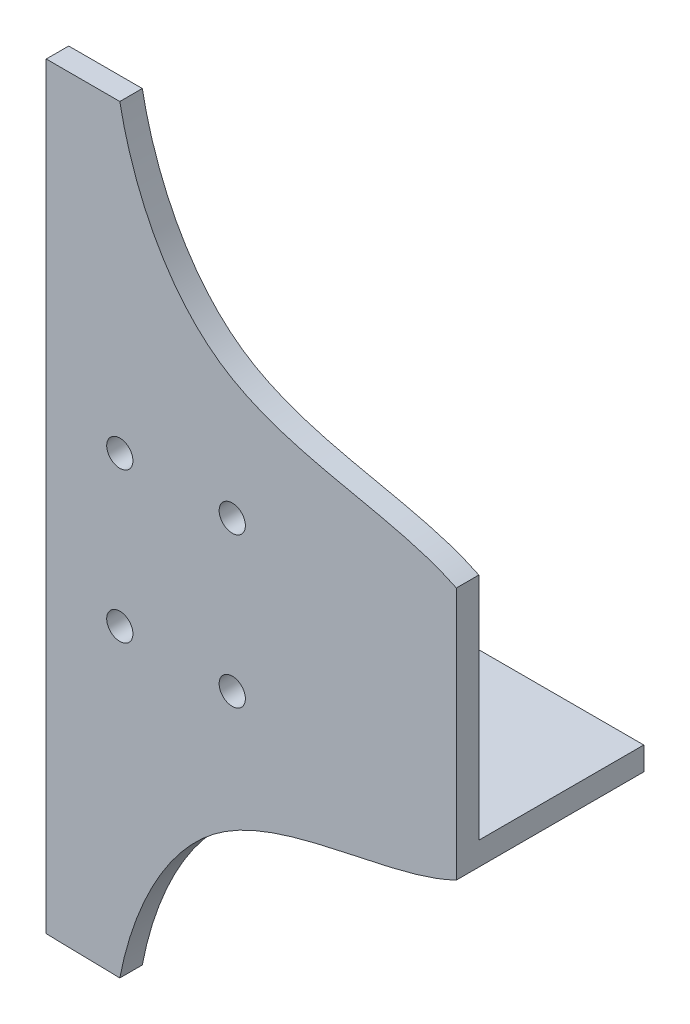
ISO-10303-21;
HEADER;
FILE_DESCRIPTION(('STEP AP214'),'2;1');
FILE_NAME('part.step','',(''),(''),'','','');
FILE_SCHEMA(('AUTOMOTIVE_DESIGN { 1 0 10303 214 1 1 1 1 }'));
ENDSEC;
DATA;
#1=APPLICATION_CONTEXT('core data for automotive mechanical design processes');
#2=APPLICATION_PROTOCOL_DEFINITION('international standard','automotive_design',2000,#1);
#3=PRODUCT_CONTEXT('',#1,'mechanical');
#4=PRODUCT('Part','Part','',(#3));
#5=PRODUCT_RELATED_PRODUCT_CATEGORY('part','',(#4));
#6=PRODUCT_DEFINITION_FORMATION('','',#4);
#7=PRODUCT_DEFINITION_CONTEXT('part definition',#1,'design');
#8=PRODUCT_DEFINITION('design','',#6,#7);
#9=PRODUCT_DEFINITION_SHAPE('','',#8);
#10=(LENGTH_UNIT() NAMED_UNIT(*) SI_UNIT(.MILLI.,.METRE.));
#11=(NAMED_UNIT(*) PLANE_ANGLE_UNIT() SI_UNIT($,.RADIAN.));
#12=(NAMED_UNIT(*) SI_UNIT($,.STERADIAN.) SOLID_ANGLE_UNIT());
#13=UNCERTAINTY_MEASURE_WITH_UNIT(LENGTH_MEASURE(1.E-05),#10,'distance_accuracy_value','');
#14=(GEOMETRIC_REPRESENTATION_CONTEXT(3) GLOBAL_UNCERTAINTY_ASSIGNED_CONTEXT((#13)) GLOBAL_UNIT_ASSIGNED_CONTEXT((#10,
#11,#12)) REPRESENTATION_CONTEXT('',''));
#15=CARTESIAN_POINT('',(0.,0.,0.));
#16=DIRECTION('',(0.,0.,1.));
#17=DIRECTION('',(1.,0.,0.));
#18=AXIS2_PLACEMENT_3D('',#15,#16,#17);
#19=CARTESIAN_POINT('',(25.7096128380882,-25.6261632332562,0.));
#20=DIRECTION('',(0.,0.,1.));
#21=DIRECTION('',(1.,0.,0.));
#22=AXIS2_PLACEMENT_3D('',#19,#20,#21);
#23=PLANE('',#22);
#24=CARTESIAN_POINT('',(9.85,-10.0000000000001,0.));
#25=DIRECTION('',(0.,0.,1.));
#26=DIRECTION('',(1.,0.,0.));
#27=AXIS2_PLACEMENT_3D('',#24,#25,#26);
#28=CIRCLE('',#27,1.75);
#29=CARTESIAN_POINT('',(11.6,-10.0000000000001,0.));
#30=VERTEX_POINT('',#29);
#31=EDGE_CURVE('E136',#30,#30,#28,.T.);
#32=ORIENTED_EDGE('',*,*,#31,.T.);
#33=EDGE_LOOP('',(#32));
#34=FACE_BOUND('',#33,.T.);
#35=CARTESIAN_POINT('',(24.85,-10.0000000000001,0.));
#36=DIRECTION('',(0.,0.,1.));
#37=DIRECTION('',(1.,0.,0.));
#38=AXIS2_PLACEMENT_3D('',#35,#36,#37);
#39=CIRCLE('',#38,1.75);
#40=CARTESIAN_POINT('',(26.6,-10.0000000000001,0.));
#41=VERTEX_POINT('',#40);
#42=EDGE_CURVE('E146',#41,#41,#39,.T.);
#43=ORIENTED_EDGE('',*,*,#42,.T.);
#44=EDGE_LOOP('',(#43));
#45=FACE_BOUND('',#44,.T.);
#46=CARTESIAN_POINT('',(24.85,9.99999999999991,0.));
#47=DIRECTION('',(0.,0.,1.));
#48=DIRECTION('',(1.,0.,0.));
#49=AXIS2_PLACEMENT_3D('',#46,#47,#48);
#50=CIRCLE('',#49,1.75);
#51=CARTESIAN_POINT('',(26.6,9.99999999999991,0.));
#52=VERTEX_POINT('',#51);
#53=EDGE_CURVE('E151',#52,#52,#50,.T.);
#54=ORIENTED_EDGE('',*,*,#53,.T.);
#55=EDGE_LOOP('',(#54));
#56=FACE_BOUND('',#55,.T.);
#57=CARTESIAN_POINT('',(9.85,9.99999999999991,0.));
#58=DIRECTION('',(0.,0.,1.));
#59=DIRECTION('',(1.,0.,0.));
#60=AXIS2_PLACEMENT_3D('',#57,#58,#59);
#61=CIRCLE('',#60,1.75);
#62=CARTESIAN_POINT('',(11.6,9.99999999999991,0.));
#63=VERTEX_POINT('',#62);
#64=EDGE_CURVE('E157',#63,#63,#61,.T.);
#65=ORIENTED_EDGE('',*,*,#64,.T.);
#66=EDGE_LOOP('',(#65));
#67=FACE_BOUND('',#66,.T.);
#68=DIRECTION('',(1.,0.,0.));
#69=VECTOR('',#68,1.);
#70=CARTESIAN_POINT('',(54.7461250743272,-13.7616615724123,0.));
#71=LINE('',#70,#69);
#72=CARTESIAN_POINT('',(0.0333691838635825,-13.7616615724123,0.));
#73=VERTEX_POINT('',#72);
#74=CARTESIAN_POINT('',(54.7461250743272,-13.7616615724123,0.));
#75=VERTEX_POINT('',#74);
#76=EDGE_CURVE('E53',#73,#75,#71,.T.);
#77=ORIENTED_EDGE('',*,*,#76,.F.);
#78=DIRECTION('',(0.,-1.,0.));
#79=VECTOR('',#78,1.);
#80=CARTESIAN_POINT('',(0.0333691838635825,50.6319572936936,0.));
#81=LINE('',#80,#79);
#82=CARTESIAN_POINT('',(0.0333691838635825,50.6319572936936,0.));
#83=VERTEX_POINT('',#82);
#84=EDGE_CURVE('E229',#83,#73,#81,.T.);
#85=ORIENTED_EDGE('',*,*,#84,.F.);
#86=DIRECTION('',(-1.,0.,0.));
#87=VECTOR('',#86,1.);
#88=CARTESIAN_POINT('',(9.85,50.6319572936936,0.));
#89=LINE('',#88,#87);
#90=CARTESIAN_POINT('',(9.85,50.6319572936936,0.));
#91=VERTEX_POINT('',#90);
#92=EDGE_CURVE('E163',#91,#83,#89,.T.);
#93=ORIENTED_EDGE('',*,*,#92,.F.);
#94=CARTESIAN_POINT('',(54.7461250743272,16.8731980908246,0.));
#95=CARTESIAN_POINT('',(45.7885361403111,21.2886150110364,0.));
#96=CARTESIAN_POINT('',(21.0377689368127,20.5399305747445,0.));
#97=CARTESIAN_POINT('',(11.4852943238361,41.9878824003416,0.));
#98=CARTESIAN_POINT('',(9.85,50.6319572936936,0.));
#99=B_SPLINE_CURVE_WITH_KNOTS('',3,(#94,#95,#96,#97,#98),.UNSPECIFIED.,.F.,.F.,(4,1,4),(0.,
0.549104100057966,1.),.UNSPECIFIED.);
#100=CARTESIAN_POINT('',(54.7461250743272,16.8731980908246,0.));
#101=VERTEX_POINT('',#100);
#102=EDGE_CURVE('E170',#101,#91,#99,.T.);
#103=ORIENTED_EDGE('',*,*,#102,.F.);
#104=DIRECTION('',(0.,1.,0.));
#105=VECTOR('',#104,1.);
#106=CARTESIAN_POINT('',(54.7461250743272,-16.8731980908246,0.));
#107=LINE('',#106,#105);
#108=EDGE_CURVE('E58',#75,#101,#107,.T.);
#109=ORIENTED_EDGE('',*,*,#108,.F.);
#110=EDGE_LOOP('',(#77,#85,#93,#103,#109));
#111=FACE_BOUND('',#110,.T.);
#112=ADVANCED_FACE('F38',(#34,#45,#56,#67,#111),#23,.F.);
#113=DIRECTION('',(-1.,0.,0.));
#114=VECTOR('',#113,1.);
#115=CARTESIAN_POINT('',(54.7461250743272,-16.8731980908246,0.));
#116=LINE('',#115,#114);
#117=CARTESIAN_POINT('',(54.7461250743272,-16.8731980908246,0.));
#118=VERTEX_POINT('',#117);
#119=CARTESIAN_POINT('',(0.0333691838635825,-16.8731980908246,0.));
#120=VERTEX_POINT('',#119);
#121=EDGE_CURVE('E262',#118,#120,#116,.T.);
#122=ORIENTED_EDGE('',*,*,#121,.F.);
#123=CARTESIAN_POINT('',(9.85,-50.6319572936936,0.));
#124=CARTESIAN_POINT('',(11.4852943238361,-41.9878824003416,0.));
#125=CARTESIAN_POINT('',(21.0377689368127,-20.5399305747445,0.));
#126=CARTESIAN_POINT('',(45.7885361403111,-21.2886150110364,0.));
#127=CARTESIAN_POINT('',(54.7461250743272,-16.8731980908246,0.));
#128=B_SPLINE_CURVE_WITH_KNOTS('',3,(#123,#124,#125,#126,#127),.UNSPECIFIED.,.F.,.F.,(4,1,4),
(0.,0.450895899942034,1.),.UNSPECIFIED.);
#129=CARTESIAN_POINT('',(9.85,-50.6319572936936,0.));
#130=VERTEX_POINT('',#129);
#131=EDGE_CURVE('E233',#130,#118,#128,.T.);
#132=ORIENTED_EDGE('',*,*,#131,.F.);
#133=DIRECTION('',(0.999776982868837,-0.0211183457137456,0.));
#134=VECTOR('',#133,1.);
#135=CARTESIAN_POINT('',(0.0333691838635825,-50.4246000461558,0.));
#136=LINE('',#135,#134);
#137=CARTESIAN_POINT('',(0.0333691838635825,-50.4246000461558,0.));
#138=VERTEX_POINT('',#137);
#139=EDGE_CURVE('E231',#138,#130,#136,.T.);
#140=ORIENTED_EDGE('',*,*,#139,.F.);
#141=EDGE_CURVE('E228',#120,#138,#81,.T.);
#142=ORIENTED_EDGE('',*,*,#141,.F.);
#143=EDGE_LOOP('',(#122,#132,#140,#142));
#144=FACE_BOUND('',#143,.T.);
#145=ADVANCED_FACE('F203',(#144),#23,.F.);
#146=CARTESIAN_POINT('',(25.7096128380882,-25.6261632332562,3.));
#147=DIRECTION('',(0.,0.,1.));
#148=DIRECTION('',(1.,0.,0.));
#149=AXIS2_PLACEMENT_3D('',#146,#147,#148);
#150=PLANE('',#149);
#151=CARTESIAN_POINT('',(24.85,-10.0000000000001,3.));
#152=DIRECTION('',(0.,0.,1.));
#153=DIRECTION('',(1.,0.,0.));
#154=AXIS2_PLACEMENT_3D('',#151,#152,#153);
#155=CIRCLE('',#154,1.75);
#156=CARTESIAN_POINT('',(26.6,-10.0000000000001,3.));
#157=VERTEX_POINT('',#156);
#158=EDGE_CURVE('E148',#157,#157,#155,.T.);
#159=ORIENTED_EDGE('',*,*,#158,.F.);
#160=EDGE_LOOP('',(#159));
#161=FACE_BOUND('',#160,.T.);
#162=CARTESIAN_POINT('',(9.85,9.99999999999991,3.));
#163=DIRECTION('',(0.,0.,1.));
#164=DIRECTION('',(1.,0.,0.));
#165=AXIS2_PLACEMENT_3D('',#162,#163,#164);
#166=CIRCLE('',#165,1.75);
#167=CARTESIAN_POINT('',(11.6,9.99999999999991,3.));
#168=VERTEX_POINT('',#167);
#169=EDGE_CURVE('E160',#168,#168,#166,.T.);
#170=ORIENTED_EDGE('',*,*,#169,.F.);
#171=EDGE_LOOP('',(#170));
#172=FACE_BOUND('',#171,.T.);
#173=DIRECTION('',(-1.,0.,0.));
#174=VECTOR('',#173,1.);
#175=CARTESIAN_POINT('',(9.85,50.6319572936936,3.));
#176=LINE('',#175,#174);
#177=CARTESIAN_POINT('',(9.85,50.6319572936936,3.));
#178=VERTEX_POINT('',#177);
#179=CARTESIAN_POINT('',(0.0333691838635825,50.6319572936936,3.));
#180=VERTEX_POINT('',#179);
#181=EDGE_CURVE('E166',#178,#180,#176,.T.);
#182=ORIENTED_EDGE('',*,*,#181,.T.);
#183=DIRECTION('',(0.,-1.,0.));
#184=VECTOR('',#183,1.);
#185=CARTESIAN_POINT('',(0.0333691838635825,50.6319572936936,3.));
#186=LINE('',#185,#184);
#187=CARTESIAN_POINT('',(0.0333691838635825,-50.4246000461558,3.));
#188=VERTEX_POINT('',#187);
#189=EDGE_CURVE('E169',#180,#188,#186,.T.);
#190=ORIENTED_EDGE('',*,*,#189,.T.);
#191=DIRECTION('',(0.999776982868837,-0.0211183457137456,0.));
#192=VECTOR('',#191,1.);
#193=CARTESIAN_POINT('',(0.0333691838635825,-50.4246000461558,3.));
#194=LINE('',#193,#192);
#195=CARTESIAN_POINT('',(9.85,-50.6319572936936,3.));
#196=VERTEX_POINT('',#195);
#197=EDGE_CURVE('E172',#188,#196,#194,.T.);
#198=ORIENTED_EDGE('',*,*,#197,.T.);
#199=CARTESIAN_POINT('',(9.85,-50.6319572936936,3.));
#200=CARTESIAN_POINT('',(11.4852943238361,-41.9878824003416,3.));
#201=CARTESIAN_POINT('',(21.0377689368127,-20.5399305747445,3.));
#202=CARTESIAN_POINT('',(45.7885361403111,-21.2886150110364,3.));
#203=CARTESIAN_POINT('',(54.7461250743272,-16.8731980908246,3.));
#204=B_SPLINE_CURVE_WITH_KNOTS('',3,(#199,#200,#201,#202,#203),.UNSPECIFIED.,.F.,.F.,(4,1,4),
(0.,0.450895899942034,1.),.UNSPECIFIED.);
#205=CARTESIAN_POINT('',(54.7461250743272,-16.8731980908246,3.));
#206=VERTEX_POINT('',#205);
#207=EDGE_CURVE('E174',#196,#206,#204,.T.);
#208=ORIENTED_EDGE('',*,*,#207,.T.);
#209=DIRECTION('',(0.,1.,0.));
#210=VECTOR('',#209,1.);
#211=CARTESIAN_POINT('',(54.7461250743272,-16.8731980908246,3.));
#212=LINE('',#211,#210);
#213=CARTESIAN_POINT('',(54.7461250743272,16.8731980908246,3.));
#214=VERTEX_POINT('',#213);
#215=EDGE_CURVE('E179',#206,#214,#212,.T.);
#216=ORIENTED_EDGE('',*,*,#215,.T.);
#217=CARTESIAN_POINT('',(54.7461250743272,16.8731980908246,3.));
#218=CARTESIAN_POINT('',(45.7885361403111,21.2886150110364,3.));
#219=CARTESIAN_POINT('',(21.0377689368127,20.5399305747445,3.));
#220=CARTESIAN_POINT('',(11.4852943238361,41.9878824003416,3.));
#221=CARTESIAN_POINT('',(9.85,50.6319572936936,3.));
#222=B_SPLINE_CURVE_WITH_KNOTS('',3,(#217,#218,#219,#220,#221),.UNSPECIFIED.,.F.,.F.,(4,1,4),
(0.,0.549104100057966,1.),.UNSPECIFIED.);
#223=EDGE_CURVE('E217',#214,#178,#222,.T.);
#224=ORIENTED_EDGE('',*,*,#223,.T.);
#225=EDGE_LOOP('',(#182,#190,#198,#208,#216,#224));
#226=FACE_BOUND('',#225,.T.);
#227=CARTESIAN_POINT('',(24.85,9.99999999999991,3.));
#228=DIRECTION('',(0.,0.,1.));
#229=DIRECTION('',(1.,0.,0.));
#230=AXIS2_PLACEMENT_3D('',#227,#228,#229);
#231=CIRCLE('',#230,1.75);
#232=CARTESIAN_POINT('',(26.6,9.99999999999991,3.));
#233=VERTEX_POINT('',#232);
#234=EDGE_CURVE('E154',#233,#233,#231,.T.);
#235=ORIENTED_EDGE('',*,*,#234,.F.);
#236=EDGE_LOOP('',(#235));
#237=FACE_BOUND('',#236,.T.);
#238=CARTESIAN_POINT('',(9.85,-10.0000000000001,3.));
#239=DIRECTION('',(0.,0.,1.));
#240=DIRECTION('',(1.,0.,0.));
#241=AXIS2_PLACEMENT_3D('',#238,#239,#240);
#242=CIRCLE('',#241,1.75);
#243=CARTESIAN_POINT('',(11.6,-10.0000000000001,3.));
#244=VERTEX_POINT('',#243);
#245=EDGE_CURVE('E139',#244,#244,#242,.T.);
#246=ORIENTED_EDGE('',*,*,#245,.F.);
#247=EDGE_LOOP('',(#246));
#248=FACE_BOUND('',#247,.T.);
#249=ADVANCED_FACE('F200',(#161,#172,#226,#237,#248),#150,.T.);
#250=CARTESIAN_POINT('',(9.85,50.6319572936936,3.));
#251=DIRECTION('',(0.,-1.,0.));
#252=DIRECTION('',(0.,0.,-1.));
#253=AXIS2_PLACEMENT_3D('',#250,#251,#252);
#254=PLANE('',#253);
#255=ORIENTED_EDGE('',*,*,#92,.T.);
#256=DIRECTION('',(0.,0.,-1.));
#257=VECTOR('',#256,1.);
#258=CARTESIAN_POINT('',(0.0333691838635825,50.6319572936936,3.));
#259=LINE('',#258,#257);
#260=EDGE_CURVE('E12',#180,#83,#259,.T.);
#261=ORIENTED_EDGE('',*,*,#260,.F.);
#262=ORIENTED_EDGE('',*,*,#181,.F.);
#263=DIRECTION('',(0.,0.,-1.));
#264=VECTOR('',#263,1.);
#265=CARTESIAN_POINT('',(9.85,50.6319572936936,3.));
#266=LINE('',#265,#264);
#267=EDGE_CURVE('E222',#178,#91,#266,.T.);
#268=ORIENTED_EDGE('',*,*,#267,.T.);
#269=EDGE_LOOP('',(#255,#261,#262,#268));
#270=FACE_BOUND('',#269,.T.);
#271=ADVANCED_FACE('F40',(#270),#254,.F.);
#272=CARTESIAN_POINT('',(0.0333691838635825,50.6319572936936,3.));
#273=DIRECTION('',(1.,0.,0.));
#274=DIRECTION('',(0.,0.,-1.));
#275=AXIS2_PLACEMENT_3D('',#272,#273,#274);
#276=PLANE('',#275);
#277=ORIENTED_EDGE('',*,*,#84,.T.);
#278=DIRECTION('',(0.,0.,1.));
#279=VECTOR('',#278,1.);
#280=CARTESIAN_POINT('',(0.0333691838635825,-13.7616615724123,-22.));
#281=LINE('',#280,#279);
#282=CARTESIAN_POINT('',(0.0333691838635825,-13.7616615724123,-22.));
#283=VERTEX_POINT('',#282);
#284=EDGE_CURVE('E141',#283,#73,#281,.T.);
#285=ORIENTED_EDGE('',*,*,#284,.F.);
#286=DIRECTION('',(0.,1.,0.));
#287=VECTOR('',#286,1.);
#288=CARTESIAN_POINT('',(0.0333691838635825,-16.8731980908246,-22.));
#289=LINE('',#288,#287);
#290=CARTESIAN_POINT('',(0.0333691838635825,-16.8731980908246,-22.));
#291=VERTEX_POINT('',#290);
#292=EDGE_CURVE('E120',#291,#283,#289,.T.);
#293=ORIENTED_EDGE('',*,*,#292,.F.);
#294=DIRECTION('',(0.,0.,1.));
#295=VECTOR('',#294,1.);
#296=CARTESIAN_POINT('',(0.0333691838635825,-16.8731980908246,-22.));
#297=LINE('',#296,#295);
#298=EDGE_CURVE('E117',#291,#120,#297,.T.);
#299=ORIENTED_EDGE('',*,*,#298,.T.);
#300=ORIENTED_EDGE('',*,*,#141,.T.);
#301=DIRECTION('',(0.,0.,-1.));
#302=VECTOR('',#301,1.);
#303=CARTESIAN_POINT('',(0.0333691838635825,-50.4246000461558,3.));
#304=LINE('',#303,#302);
#305=EDGE_CURVE('E46',#188,#138,#304,.T.);
#306=ORIENTED_EDGE('',*,*,#305,.F.);
#307=ORIENTED_EDGE('',*,*,#189,.F.);
#308=ORIENTED_EDGE('',*,*,#260,.T.);
#309=EDGE_LOOP('',(#277,#285,#293,#299,#300,#306,#307,#308));
#310=FACE_BOUND('',#309,.T.);
#311=ADVANCED_FACE('F193',(#310),#276,.F.);
#312=CARTESIAN_POINT('',(0.0333691838635825,-50.4246000461558,3.));
#313=DIRECTION('',(0.0211183457137456,0.999776982868837,0.));
#314=DIRECTION('',(-0.999776982868837,0.0211183457137456,0.));
#315=AXIS2_PLACEMENT_3D('',#312,#313,#314);
#316=PLANE('',#315);
#317=ORIENTED_EDGE('',*,*,#139,.T.);
#318=DIRECTION('',(0.,0.,-1.));
#319=VECTOR('',#318,1.);
#320=CARTESIAN_POINT('',(9.85,-50.6319572936936,3.));
#321=LINE('',#320,#319);
#322=EDGE_CURVE('E254',#196,#130,#321,.T.);
#323=ORIENTED_EDGE('',*,*,#322,.F.);
#324=ORIENTED_EDGE('',*,*,#197,.F.);
#325=ORIENTED_EDGE('',*,*,#305,.T.);
#326=EDGE_LOOP('',(#317,#323,#324,#325));
#327=FACE_BOUND('',#326,.T.);
#328=ADVANCED_FACE('F189',(#327),#316,.F.);
#329=DIRECTION('',(0.,0.,-1.));
#330=VECTOR('',#329,1.);
#331=SURFACE_OF_LINEAR_EXTRUSION('',#204,#330);
#332=ORIENTED_EDGE('',*,*,#131,.T.);
#333=DIRECTION('',(0.,0.,-1.));
#334=VECTOR('',#333,1.);
#335=CARTESIAN_POINT('',(54.7461250743272,-16.8731980908246,3.));
#336=LINE('',#335,#334);
#337=EDGE_CURVE('E135',#206,#118,#336,.T.);
#338=ORIENTED_EDGE('',*,*,#337,.F.);
#339=ORIENTED_EDGE('',*,*,#207,.F.);
#340=ORIENTED_EDGE('',*,*,#322,.T.);
#341=EDGE_LOOP('',(#332,#338,#339,#340));
#342=FACE_BOUND('',#341,.T.);
#343=ADVANCED_FACE('F185',(#342),#331,.F.);
#344=CARTESIAN_POINT('',(54.7461250743272,-16.8731980908246,3.));
#345=DIRECTION('',(-1.,0.,0.));
#346=DIRECTION('',(0.,-1.,0.));
#347=AXIS2_PLACEMENT_3D('',#344,#345,#346);
#348=PLANE('',#347);
#349=ORIENTED_EDGE('',*,*,#337,.T.);
#350=DIRECTION('',(0.,0.,1.));
#351=VECTOR('',#350,1.);
#352=CARTESIAN_POINT('',(54.7461250743272,-16.8731980908246,-22.));
#353=LINE('',#352,#351);
#354=CARTESIAN_POINT('',(54.7461250743272,-16.8731980908246,-22.));
#355=VERTEX_POINT('',#354);
#356=EDGE_CURVE('E115',#355,#118,#353,.T.);
#357=ORIENTED_EDGE('',*,*,#356,.F.);
#358=DIRECTION('',(0.,-1.,0.));
#359=VECTOR('',#358,1.);
#360=CARTESIAN_POINT('',(54.7461250743272,-13.7616615724123,-22.));
#361=LINE('',#360,#359);
#362=CARTESIAN_POINT('',(54.7461250743272,-13.7616615724123,-22.));
#363=VERTEX_POINT('',#362);
#364=EDGE_CURVE('E121',#363,#355,#361,.T.);
#365=ORIENTED_EDGE('',*,*,#364,.F.);
#366=DIRECTION('',(0.,0.,1.));
#367=VECTOR('',#366,1.);
#368=CARTESIAN_POINT('',(54.7461250743272,-13.7616615724123,-22.));
#369=LINE('',#368,#367);
#370=EDGE_CURVE('E274',#363,#75,#369,.T.);
#371=ORIENTED_EDGE('',*,*,#370,.T.);
#372=ORIENTED_EDGE('',*,*,#108,.T.);
#373=DIRECTION('',(0.,0.,-1.));
#374=VECTOR('',#373,1.);
#375=CARTESIAN_POINT('',(54.7461250743272,16.8731980908246,3.));
#376=LINE('',#375,#374);
#377=EDGE_CURVE('E250',#214,#101,#376,.T.);
#378=ORIENTED_EDGE('',*,*,#377,.F.);
#379=ORIENTED_EDGE('',*,*,#215,.F.);
#380=EDGE_LOOP('',(#349,#357,#365,#371,#372,#378,#379));
#381=FACE_BOUND('',#380,.T.);
#382=ADVANCED_FACE('F132',(#381),#348,.F.);
#383=DIRECTION('',(0.,0.,-1.));
#384=VECTOR('',#383,1.);
#385=SURFACE_OF_LINEAR_EXTRUSION('',#222,#384);
#386=ORIENTED_EDGE('',*,*,#102,.T.);
#387=ORIENTED_EDGE('',*,*,#267,.F.);
#388=ORIENTED_EDGE('',*,*,#223,.F.);
#389=ORIENTED_EDGE('',*,*,#377,.T.);
#390=EDGE_LOOP('',(#386,#387,#388,#389));
#391=FACE_BOUND('',#390,.T.);
#392=ADVANCED_FACE('F213',(#391),#385,.F.);
#393=CARTESIAN_POINT('',(9.85,9.99999999999991,3.));
#394=DIRECTION('',(0.,0.,-1.));
#395=DIRECTION('',(-1.,0.,0.));
#396=AXIS2_PLACEMENT_3D('',#393,#394,#395);
#397=CYLINDRICAL_SURFACE('',#396,1.75);
#398=ORIENTED_EDGE('',*,*,#169,.T.);
#399=EDGE_LOOP('',(#398));
#400=FACE_BOUND('',#399,.T.);
#401=ORIENTED_EDGE('',*,*,#64,.F.);
#402=EDGE_LOOP('',(#401));
#403=FACE_BOUND('',#402,.T.);
#404=ADVANCED_FACE('F215',(#400,#403),#397,.F.);
#405=CARTESIAN_POINT('',(24.85,9.99999999999991,3.));
#406=DIRECTION('',(0.,0.,-1.));
#407=DIRECTION('',(-1.,0.,0.));
#408=AXIS2_PLACEMENT_3D('',#405,#406,#407);
#409=CYLINDRICAL_SURFACE('',#408,1.75);
#410=ORIENTED_EDGE('',*,*,#234,.T.);
#411=EDGE_LOOP('',(#410));
#412=FACE_BOUND('',#411,.T.);
#413=ORIENTED_EDGE('',*,*,#53,.F.);
#414=EDGE_LOOP('',(#413));
#415=FACE_BOUND('',#414,.T.);
#416=ADVANCED_FACE('F298',(#412,#415),#409,.F.);
#417=CARTESIAN_POINT('',(24.85,-10.0000000000001,3.));
#418=DIRECTION('',(0.,0.,-1.));
#419=DIRECTION('',(-1.,0.,0.));
#420=AXIS2_PLACEMENT_3D('',#417,#418,#419);
#421=CYLINDRICAL_SURFACE('',#420,1.75);
#422=ORIENTED_EDGE('',*,*,#158,.T.);
#423=EDGE_LOOP('',(#422));
#424=FACE_BOUND('',#423,.T.);
#425=ORIENTED_EDGE('',*,*,#42,.F.);
#426=EDGE_LOOP('',(#425));
#427=FACE_BOUND('',#426,.T.);
#428=ADVANCED_FACE('F294',(#424,#427),#421,.F.);
#429=CARTESIAN_POINT('',(9.85,-10.0000000000001,3.));
#430=DIRECTION('',(0.,0.,-1.));
#431=DIRECTION('',(-1.,0.,0.));
#432=AXIS2_PLACEMENT_3D('',#429,#430,#431);
#433=CYLINDRICAL_SURFACE('',#432,1.75);
#434=ORIENTED_EDGE('',*,*,#245,.T.);
#435=EDGE_LOOP('',(#434));
#436=FACE_BOUND('',#435,.T.);
#437=ORIENTED_EDGE('',*,*,#31,.F.);
#438=EDGE_LOOP('',(#437));
#439=FACE_BOUND('',#438,.T.);
#440=ADVANCED_FACE('F289',(#436,#439),#433,.F.);
#441=CARTESIAN_POINT('',(54.7461250743272,-16.8731980908246,-22.));
#442=DIRECTION('',(0.,1.,0.));
#443=DIRECTION('',(0.,0.,1.));
#444=AXIS2_PLACEMENT_3D('',#441,#442,#443);
#445=PLANE('',#444);
#446=ORIENTED_EDGE('',*,*,#121,.T.);
#447=ORIENTED_EDGE('',*,*,#298,.F.);
#448=DIRECTION('',(-1.,0.,0.));
#449=VECTOR('',#448,1.);
#450=CARTESIAN_POINT('',(54.7461250743272,-16.8731980908246,-22.));
#451=LINE('',#450,#449);
#452=EDGE_CURVE('E110',#355,#291,#451,.T.);
#453=ORIENTED_EDGE('',*,*,#452,.F.);
#454=ORIENTED_EDGE('',*,*,#356,.T.);
#455=EDGE_LOOP('',(#446,#447,#453,#454));
#456=FACE_BOUND('',#455,.T.);
#457=ADVANCED_FACE('F113',(#456),#445,.F.);
#458=CARTESIAN_POINT('',(54.7461250743272,-13.7616615724123,-22.));
#459=DIRECTION('',(0.,-1.,0.));
#460=DIRECTION('',(0.,0.,-1.));
#461=AXIS2_PLACEMENT_3D('',#458,#459,#460);
#462=PLANE('',#461);
#463=ORIENTED_EDGE('',*,*,#76,.T.);
#464=ORIENTED_EDGE('',*,*,#370,.F.);
#465=DIRECTION('',(1.,0.,0.));
#466=VECTOR('',#465,1.);
#467=CARTESIAN_POINT('',(54.7461250743272,-13.7616615724123,-22.));
#468=LINE('',#467,#466);
#469=EDGE_CURVE('E126',#283,#363,#468,.T.);
#470=ORIENTED_EDGE('',*,*,#469,.F.);
#471=ORIENTED_EDGE('',*,*,#284,.T.);
#472=EDGE_LOOP('',(#463,#464,#470,#471));
#473=FACE_BOUND('',#472,.T.);
#474=ADVANCED_FACE('F281',(#473),#462,.F.);
#475=CARTESIAN_POINT('',(0.,0.,-22.));
#476=DIRECTION('',(0.,0.,-1.));
#477=DIRECTION('',(-1.,0.,0.));
#478=AXIS2_PLACEMENT_3D('',#475,#476,#477);
#479=PLANE('',#478);
#480=ORIENTED_EDGE('',*,*,#364,.T.);
#481=ORIENTED_EDGE('',*,*,#452,.T.);
#482=ORIENTED_EDGE('',*,*,#292,.T.);
#483=ORIENTED_EDGE('',*,*,#469,.T.);
#484=EDGE_LOOP('',(#480,#481,#482,#483));
#485=FACE_BOUND('',#484,.T.);
#486=ADVANCED_FACE('F124',(#485),#479,.T.);
#487=CLOSED_SHELL('',(#112,#145,#249,#271,#311,#328,#343,#382,#392,#404,#416,#428,#440,#457,
#474,#486));
#488=MANIFOLD_SOLID_BREP('B2',#487);
#489=ADVANCED_BREP_SHAPE_REPRESENTATION('',(#18,#488),#14);
#490=SHAPE_DEFINITION_REPRESENTATION(#9,#489);
ENDSEC;
END-ISO-10303-21;
